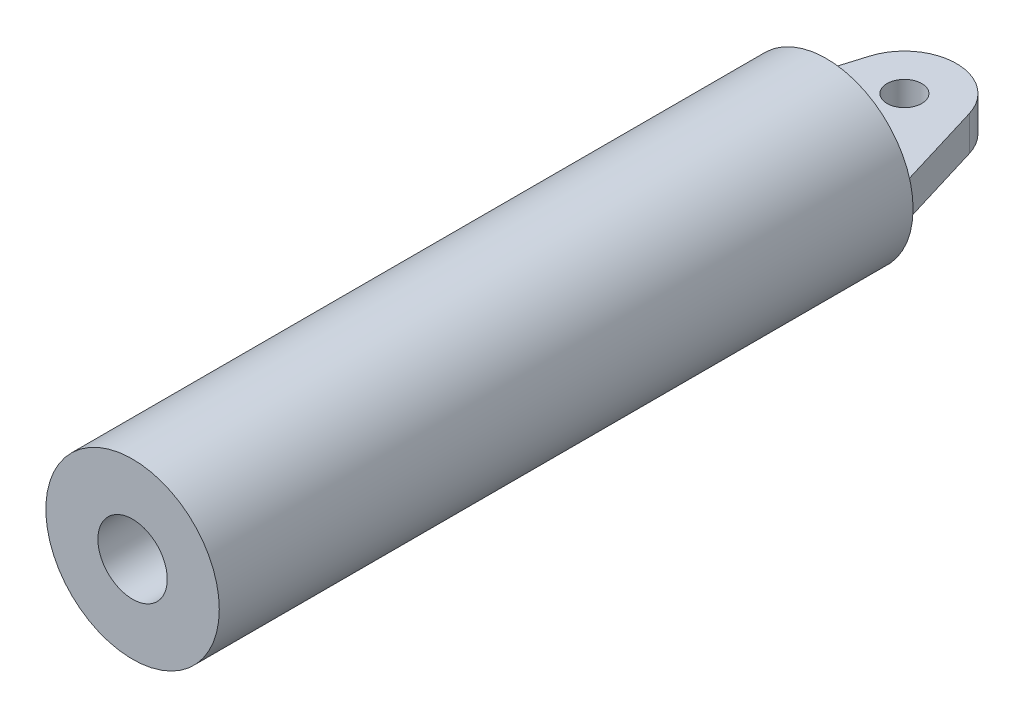
ISO-10303-21;
HEADER;
FILE_DESCRIPTION(('STEP AP214'),'2;1');
FILE_NAME('part.step','',(''),(''),'','','');
FILE_SCHEMA(('AUTOMOTIVE_DESIGN { 1 0 10303 214 1 1 1 1 }'));
ENDSEC;
DATA;
#1=APPLICATION_CONTEXT('core data for automotive mechanical design processes');
#2=APPLICATION_PROTOCOL_DEFINITION('international standard','automotive_design',2000,#1);
#3=PRODUCT_CONTEXT('',#1,'mechanical');
#4=PRODUCT('Part','Part','',(#3));
#5=PRODUCT_RELATED_PRODUCT_CATEGORY('part','',(#4));
#6=PRODUCT_DEFINITION_FORMATION('','',#4);
#7=PRODUCT_DEFINITION_CONTEXT('part definition',#1,'design');
#8=PRODUCT_DEFINITION('design','',#6,#7);
#9=PRODUCT_DEFINITION_SHAPE('','',#8);
#10=(LENGTH_UNIT() NAMED_UNIT(*) SI_UNIT(.MILLI.,.METRE.));
#11=(NAMED_UNIT(*) PLANE_ANGLE_UNIT() SI_UNIT($,.RADIAN.));
#12=(NAMED_UNIT(*) SI_UNIT($,.STERADIAN.) SOLID_ANGLE_UNIT());
#13=UNCERTAINTY_MEASURE_WITH_UNIT(LENGTH_MEASURE(1.E-05),#10,'distance_accuracy_value','');
#14=(GEOMETRIC_REPRESENTATION_CONTEXT(3) GLOBAL_UNCERTAINTY_ASSIGNED_CONTEXT((#13)) GLOBAL_UNIT_ASSIGNED_CONTEXT((#10,
#11,#12)) REPRESENTATION_CONTEXT('',''));
#15=CARTESIAN_POINT('',(0.,0.,0.));
#16=DIRECTION('',(0.,0.,1.));
#17=DIRECTION('',(1.,0.,0.));
#18=AXIS2_PLACEMENT_3D('',#15,#16,#17);
#19=CARTESIAN_POINT('',(0.,0.,400.));
#20=DIRECTION('',(0.,0.,-1.));
#21=DIRECTION('',(-1.,0.,0.));
#22=AXIS2_PLACEMENT_3D('',#19,#20,#21);
#23=CYLINDRICAL_SURFACE('',#22,50.);
#24=CARTESIAN_POINT('',(0.,0.,400.));
#25=DIRECTION('',(0.,0.,1.));
#26=DIRECTION('',(1.,0.,0.));
#27=AXIS2_PLACEMENT_3D('',#24,#25,#26);
#28=CIRCLE('',#27,50.);
#29=CARTESIAN_POINT('',(50.,0.,400.));
#30=VERTEX_POINT('',#29);
#31=EDGE_CURVE('E11',#30,#30,#28,.T.);
#32=ORIENTED_EDGE('',*,*,#31,.F.);
#33=EDGE_LOOP('',(#32));
#34=FACE_BOUND('',#33,.T.);
#35=CARTESIAN_POINT('',(0.,0.,0.));
#36=DIRECTION('',(0.,0.,1.));
#37=DIRECTION('',(1.,0.,0.));
#38=AXIS2_PLACEMENT_3D('',#35,#36,#37);
#39=CIRCLE('',#38,50.);
#40=CARTESIAN_POINT('',(50.,0.,0.));
#41=VERTEX_POINT('',#40);
#42=EDGE_CURVE('E37',#41,#41,#39,.T.);
#43=ORIENTED_EDGE('',*,*,#42,.T.);
#44=EDGE_LOOP('',(#43));
#45=FACE_BOUND('',#44,.T.);
#46=ADVANCED_FACE('F34',(#34,#45),#23,.T.);
#47=CARTESIAN_POINT('',(0.,0.,400.));
#48=DIRECTION('',(0.,0.,1.));
#49=DIRECTION('',(1.,0.,0.));
#50=AXIS2_PLACEMENT_3D('',#47,#48,#49);
#51=PLANE('',#50);
#52=CARTESIAN_POINT('',(0.,0.,400.));
#53=DIRECTION('',(0.,0.,1.));
#54=DIRECTION('',(1.,0.,0.));
#55=AXIS2_PLACEMENT_3D('',#52,#53,#54);
#56=CIRCLE('',#55,20.);
#57=CARTESIAN_POINT('',(20.,0.,400.));
#58=VERTEX_POINT('',#57);
#59=EDGE_CURVE('E116',#58,#58,#56,.T.);
#60=ORIENTED_EDGE('',*,*,#59,.F.);
#61=EDGE_LOOP('',(#60));
#62=FACE_BOUND('',#61,.T.);
#63=ORIENTED_EDGE('',*,*,#31,.T.);
#64=EDGE_LOOP('',(#63));
#65=FACE_BOUND('',#64,.T.);
#66=ADVANCED_FACE('F127',(#62,#65),#51,.T.);
#67=CARTESIAN_POINT('',(0.,0.,0.));
#68=DIRECTION('',(0.,0.,1.));
#69=DIRECTION('',(1.,0.,0.));
#70=AXIS2_PLACEMENT_3D('',#67,#68,#69);
#71=PLANE('',#70);
#72=DIRECTION('',(0.,-1.,0.));
#73=VECTOR('',#72,1.);
#74=CARTESIAN_POINT('',(45.,10.,0.));
#75=LINE('',#74,#73);
#76=CARTESIAN_POINT('',(45.,10.,0.));
#77=VERTEX_POINT('',#76);
#78=CARTESIAN_POINT('',(45.,-10.,0.));
#79=VERTEX_POINT('',#78);
#80=EDGE_CURVE('E48',#77,#79,#75,.T.);
#81=ORIENTED_EDGE('',*,*,#80,.F.);
#82=DIRECTION('',(1.,0.,0.));
#83=VECTOR('',#82,1.);
#84=CARTESIAN_POINT('',(0.,10.,0.));
#85=LINE('',#84,#83);
#86=CARTESIAN_POINT('',(-45.,10.,0.));
#87=VERTEX_POINT('',#86);
#88=EDGE_CURVE('E52',#87,#77,#85,.T.);
#89=ORIENTED_EDGE('',*,*,#88,.F.);
#90=DIRECTION('',(0.,-1.,0.));
#91=VECTOR('',#90,1.);
#92=CARTESIAN_POINT('',(-45.,10.,0.));
#93=LINE('',#92,#91);
#94=CARTESIAN_POINT('',(-45.,-10.,0.));
#95=VERTEX_POINT('',#94);
#96=EDGE_CURVE('E94',#87,#95,#93,.T.);
#97=ORIENTED_EDGE('',*,*,#96,.T.);
#98=DIRECTION('',(1.,0.,0.));
#99=VECTOR('',#98,1.);
#100=CARTESIAN_POINT('',(0.,-10.,0.));
#101=LINE('',#100,#99);
#102=EDGE_CURVE('E101',#95,#79,#101,.T.);
#103=ORIENTED_EDGE('',*,*,#102,.T.);
#104=EDGE_LOOP('',(#81,#89,#97,#103));
#105=FACE_BOUND('',#104,.T.);
#106=ORIENTED_EDGE('',*,*,#42,.F.);
#107=EDGE_LOOP('',(#106));
#108=FACE_BOUND('',#107,.T.);
#109=ADVANCED_FACE('F124',(#105,#108),#71,.F.);
#110=CARTESIAN_POINT('',(0.,0.,400.));
#111=DIRECTION('',(0.,0.,-1.));
#112=DIRECTION('',(-1.,0.,0.));
#113=AXIS2_PLACEMENT_3D('',#110,#111,#112);
#114=CYLINDRICAL_SURFACE('',#113,20.);
#115=ORIENTED_EDGE('',*,*,#59,.T.);
#116=EDGE_LOOP('',(#115));
#117=FACE_BOUND('',#116,.T.);
#118=CARTESIAN_POINT('',(0.,0.,30.));
#119=DIRECTION('',(0.,0.,1.));
#120=DIRECTION('',(1.,0.,0.));
#121=AXIS2_PLACEMENT_3D('',#118,#119,#120);
#122=CIRCLE('',#121,20.);
#123=CARTESIAN_POINT('',(20.,0.,30.));
#124=VERTEX_POINT('',#123);
#125=EDGE_CURVE('E113',#124,#124,#122,.T.);
#126=ORIENTED_EDGE('',*,*,#125,.F.);
#127=EDGE_LOOP('',(#126));
#128=FACE_BOUND('',#127,.T.);
#129=ADVANCED_FACE('F126',(#117,#128),#114,.F.);
#130=CARTESIAN_POINT('',(0.,0.,30.));
#131=DIRECTION('',(0.,0.,1.));
#132=DIRECTION('',(1.,0.,0.));
#133=AXIS2_PLACEMENT_3D('',#130,#131,#132);
#134=PLANE('',#133);
#135=ORIENTED_EDGE('',*,*,#125,.T.);
#136=EDGE_LOOP('',(#135));
#137=FACE_BOUND('',#136,.T.);
#138=ADVANCED_FACE('F132',(#137),#134,.T.);
#139=CARTESIAN_POINT('',(41.2082869338697,10.,-12.5));
#140=DIRECTION('',(0.956942897795657,0.,-0.29027623112899));
#141=DIRECTION('',(-0.29027623112899,0.,-0.956942897795657));
#142=AXIS2_PLACEMENT_3D('',#139,#140,#141);
#143=PLANE('',#142);
#144=DIRECTION('',(0.29027623112899,0.,0.956942897795657));
#145=VECTOR('',#144,1.);
#146=CARTESIAN_POINT('',(41.2082869338697,-10.,-12.5));
#147=LINE('',#146,#145);
#148=CARTESIAN_POINT('',(28.7082869338697,-10.,-53.7082869338697));
#149=VERTEX_POINT('',#148);
#150=EDGE_CURVE('E77',#149,#79,#147,.T.);
#151=ORIENTED_EDGE('',*,*,#150,.F.);
#152=DIRECTION('',(0.,-1.,0.));
#153=VECTOR('',#152,1.);
#154=CARTESIAN_POINT('',(28.7082869338697,10.,-53.7082869338697));
#155=LINE('',#154,#153);
#156=CARTESIAN_POINT('',(28.7082869338697,10.,-53.7082869338697));
#157=VERTEX_POINT('',#156);
#158=EDGE_CURVE('E72',#157,#149,#155,.T.);
#159=ORIENTED_EDGE('',*,*,#158,.F.);
#160=DIRECTION('',(0.29027623112899,0.,0.956942897795657));
#161=VECTOR('',#160,1.);
#162=CARTESIAN_POINT('',(41.2082869338697,10.,-12.5));
#163=LINE('',#162,#161);
#164=EDGE_CURVE('E75',#157,#77,#163,.T.);
#165=ORIENTED_EDGE('',*,*,#164,.T.);
#166=ORIENTED_EDGE('',*,*,#80,.T.);
#167=EDGE_LOOP('',(#151,#159,#165,#166));
#168=FACE_BOUND('',#167,.T.);
#169=ADVANCED_FACE('F74',(#168),#143,.T.);
#170=CARTESIAN_POINT('',(0.,10.,-45.));
#171=DIRECTION('',(0.,-1.,0.));
#172=DIRECTION('',(0.,0.,-1.));
#173=AXIS2_PLACEMENT_3D('',#170,#171,#172);
#174=CYLINDRICAL_SURFACE('',#173,30.);
#175=CARTESIAN_POINT('',(0.,-10.,-45.));
#176=DIRECTION('',(0.,1.,0.));
#177=DIRECTION('',(0.,0.,1.));
#178=AXIS2_PLACEMENT_3D('',#175,#176,#177);
#179=CIRCLE('',#178,30.);
#180=CARTESIAN_POINT('',(-28.7082869338697,-10.,-53.7082869338697));
#181=VERTEX_POINT('',#180);
#182=EDGE_CURVE('E104',#181,#149,#179,.F.);
#183=ORIENTED_EDGE('',*,*,#182,.F.);
#184=DIRECTION('',(0.,-1.,0.));
#185=VECTOR('',#184,1.);
#186=CARTESIAN_POINT('',(-28.7082869338697,10.,-53.7082869338697));
#187=LINE('',#186,#185);
#188=CARTESIAN_POINT('',(-28.7082869338697,10.,-53.7082869338697));
#189=VERTEX_POINT('',#188);
#190=EDGE_CURVE('E82',#189,#181,#187,.T.);
#191=ORIENTED_EDGE('',*,*,#190,.F.);
#192=CARTESIAN_POINT('',(0.,10.,-45.));
#193=DIRECTION('',(0.,1.,0.));
#194=DIRECTION('',(0.,0.,1.));
#195=AXIS2_PLACEMENT_3D('',#192,#193,#194);
#196=CIRCLE('',#195,30.);
#197=EDGE_CURVE('E88',#189,#157,#196,.F.);
#198=ORIENTED_EDGE('',*,*,#197,.T.);
#199=ORIENTED_EDGE('',*,*,#158,.T.);
#200=EDGE_LOOP('',(#183,#191,#198,#199));
#201=FACE_BOUND('',#200,.T.);
#202=ADVANCED_FACE('F91',(#201),#174,.T.);
#203=CARTESIAN_POINT('',(0.,10.,-45.));
#204=DIRECTION('',(0.,-1.,0.));
#205=DIRECTION('',(0.,0.,-1.));
#206=AXIS2_PLACEMENT_3D('',#203,#204,#205);
#207=CYLINDRICAL_SURFACE('',#206,10.);
#208=CARTESIAN_POINT('',(0.,10.,-45.));
#209=DIRECTION('',(0.,1.,0.));
#210=DIRECTION('',(0.,0.,1.));
#211=AXIS2_PLACEMENT_3D('',#208,#209,#210);
#212=CIRCLE('',#211,10.);
#213=CARTESIAN_POINT('',(0.,10.,-35.));
#214=VERTEX_POINT('',#213);
#215=EDGE_CURVE('E109',#214,#214,#212,.T.);
#216=ORIENTED_EDGE('',*,*,#215,.T.);
#217=EDGE_LOOP('',(#216));
#218=FACE_BOUND('',#217,.T.);
#219=CARTESIAN_POINT('',(0.,-10.,-45.));
#220=DIRECTION('',(0.,1.,0.));
#221=DIRECTION('',(0.,0.,1.));
#222=AXIS2_PLACEMENT_3D('',#219,#220,#221);
#223=CIRCLE('',#222,10.);
#224=CARTESIAN_POINT('',(0.,-10.,-35.));
#225=VERTEX_POINT('',#224);
#226=EDGE_CURVE('E98',#225,#225,#223,.T.);
#227=ORIENTED_EDGE('',*,*,#226,.F.);
#228=EDGE_LOOP('',(#227));
#229=FACE_BOUND('',#228,.T.);
#230=ADVANCED_FACE('F182',(#218,#229),#207,.F.);
#231=CARTESIAN_POINT('',(-41.2082869338697,10.,-12.5));
#232=DIRECTION('',(-0.956942897795657,0.,-0.29027623112899));
#233=DIRECTION('',(-0.29027623112899,0.,0.956942897795657));
#234=AXIS2_PLACEMENT_3D('',#231,#232,#233);
#235=PLANE('',#234);
#236=DIRECTION('',(0.29027623112899,0.,-0.956942897795657));
#237=VECTOR('',#236,1.);
#238=CARTESIAN_POINT('',(-41.2082869338697,-10.,-12.5));
#239=LINE('',#238,#237);
#240=EDGE_CURVE('E106',#95,#181,#239,.T.);
#241=ORIENTED_EDGE('',*,*,#240,.F.);
#242=ORIENTED_EDGE('',*,*,#96,.F.);
#243=DIRECTION('',(0.29027623112899,0.,-0.956942897795657));
#244=VECTOR('',#243,1.);
#245=CARTESIAN_POINT('',(-41.2082869338697,10.,-12.5));
#246=LINE('',#245,#244);
#247=EDGE_CURVE('E92',#87,#189,#246,.T.);
#248=ORIENTED_EDGE('',*,*,#247,.T.);
#249=ORIENTED_EDGE('',*,*,#190,.T.);
#250=EDGE_LOOP('',(#241,#242,#248,#249));
#251=FACE_BOUND('',#250,.T.);
#252=ADVANCED_FACE('F191',(#251),#235,.T.);
#253=CARTESIAN_POINT('',(0.,10.,0.));
#254=DIRECTION('',(0.,1.,0.));
#255=DIRECTION('',(0.,0.,1.));
#256=AXIS2_PLACEMENT_3D('',#253,#254,#255);
#257=PLANE('',#256);
#258=ORIENTED_EDGE('',*,*,#215,.F.);
#259=EDGE_LOOP('',(#258));
#260=FACE_BOUND('',#259,.T.);
#261=ORIENTED_EDGE('',*,*,#88,.T.);
#262=ORIENTED_EDGE('',*,*,#164,.F.);
#263=ORIENTED_EDGE('',*,*,#197,.F.);
#264=ORIENTED_EDGE('',*,*,#247,.F.);
#265=EDGE_LOOP('',(#261,#262,#263,#264));
#266=FACE_BOUND('',#265,.T.);
#267=ADVANCED_FACE('F86',(#260,#266),#257,.T.);
#268=CARTESIAN_POINT('',(0.,-10.,0.));
#269=DIRECTION('',(0.,1.,0.));
#270=DIRECTION('',(0.,0.,1.));
#271=AXIS2_PLACEMENT_3D('',#268,#269,#270);
#272=PLANE('',#271);
#273=ORIENTED_EDGE('',*,*,#226,.T.);
#274=EDGE_LOOP('',(#273));
#275=FACE_BOUND('',#274,.T.);
#276=ORIENTED_EDGE('',*,*,#102,.F.);
#277=ORIENTED_EDGE('',*,*,#240,.T.);
#278=ORIENTED_EDGE('',*,*,#182,.T.);
#279=ORIENTED_EDGE('',*,*,#150,.T.);
#280=EDGE_LOOP('',(#276,#277,#278,#279));
#281=FACE_BOUND('',#280,.T.);
#282=ADVANCED_FACE('F211',(#275,#281),#272,.F.);
#283=CLOSED_SHELL('',(#46,#66,#109,#129,#138,#169,#202,#230,#252,#267,#282));
#284=MANIFOLD_SOLID_BREP('B2',#283);
#285=ADVANCED_BREP_SHAPE_REPRESENTATION('',(#18,#284),#14);
#286=SHAPE_DEFINITION_REPRESENTATION(#9,#285);
ENDSEC;
END-ISO-10303-21;
